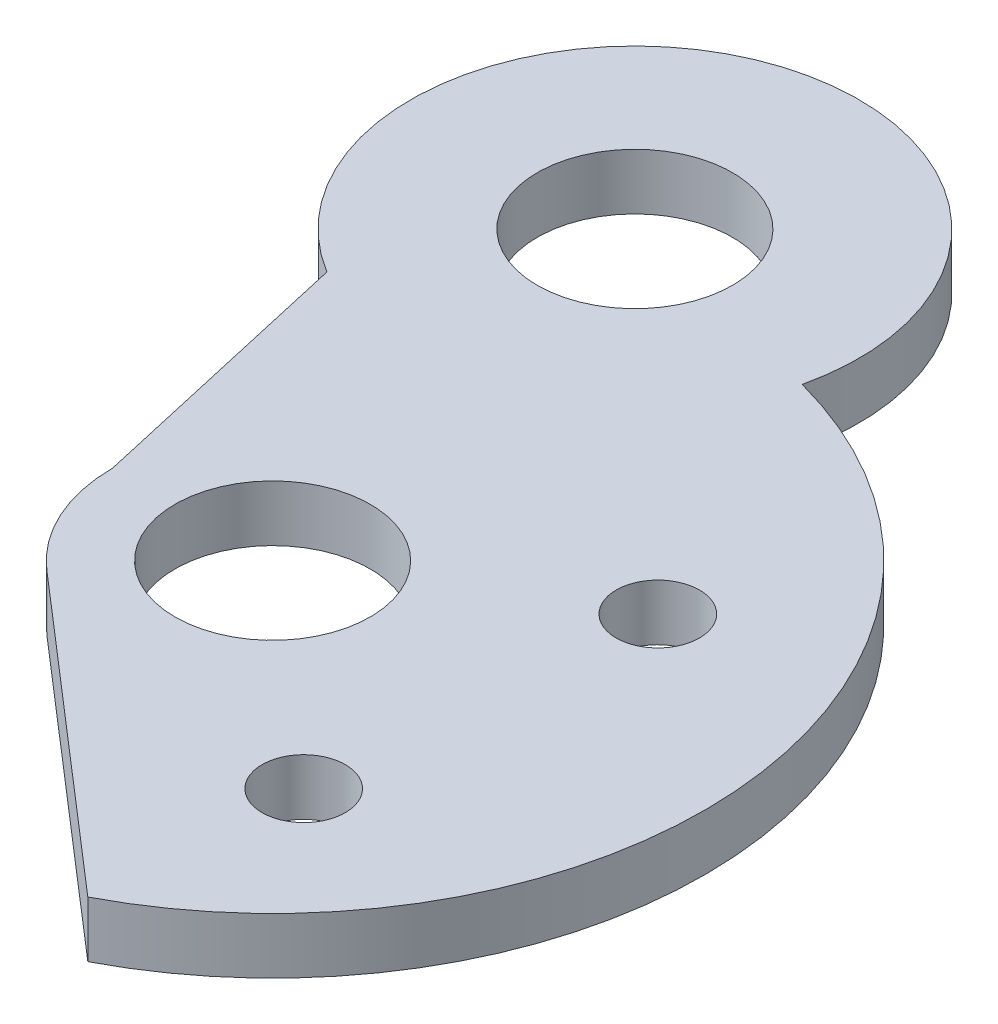
ISO-10303-21;
HEADER;
FILE_DESCRIPTION(('STEP AP214'),'2;1');
FILE_NAME('part.step','',(''),(''),'','','');
FILE_SCHEMA(('AUTOMOTIVE_DESIGN { 1 0 10303 214 1 1 1 1 }'));
ENDSEC;
DATA;
#1=APPLICATION_CONTEXT('core data for automotive mechanical design processes');
#2=APPLICATION_PROTOCOL_DEFINITION('international standard','automotive_design',2000,#1);
#3=PRODUCT_CONTEXT('',#1,'mechanical');
#4=PRODUCT('Part','Part','',(#3));
#5=PRODUCT_RELATED_PRODUCT_CATEGORY('part','',(#4));
#6=PRODUCT_DEFINITION_FORMATION('','',#4);
#7=PRODUCT_DEFINITION_CONTEXT('part definition',#1,'design');
#8=PRODUCT_DEFINITION('design','',#6,#7);
#9=PRODUCT_DEFINITION_SHAPE('','',#8);
#10=(LENGTH_UNIT() NAMED_UNIT(*) SI_UNIT(.MILLI.,.METRE.));
#11=(NAMED_UNIT(*) PLANE_ANGLE_UNIT() SI_UNIT($,.RADIAN.));
#12=(NAMED_UNIT(*) SI_UNIT($,.STERADIAN.) SOLID_ANGLE_UNIT());
#13=UNCERTAINTY_MEASURE_WITH_UNIT(LENGTH_MEASURE(1.E-05),#10,'distance_accuracy_value','');
#14=(GEOMETRIC_REPRESENTATION_CONTEXT(3) GLOBAL_UNCERTAINTY_ASSIGNED_CONTEXT((#13)) GLOBAL_UNIT_ASSIGNED_CONTEXT((#10,
#11,#12)) REPRESENTATION_CONTEXT('',''));
#15=CARTESIAN_POINT('',(0.,0.,0.));
#16=DIRECTION('',(0.,0.,1.));
#17=DIRECTION('',(1.,0.,0.));
#18=AXIS2_PLACEMENT_3D('',#15,#16,#17);
#19=CARTESIAN_POINT('',(0.,0.,0.));
#20=DIRECTION('',(0.,1.,0.));
#21=DIRECTION('',(0.,0.,1.));
#22=AXIS2_PLACEMENT_3D('',#19,#20,#21);
#23=PLANE('',#22);
#24=CARTESIAN_POINT('',(14.9212028761966,0.,-9.14372488252911));
#25=DIRECTION('',(0.,1.,0.));
#26=DIRECTION('',(0.,0.,1.));
#27=AXIS2_PLACEMENT_3D('',#24,#25,#26);
#28=CIRCLE('',#27,2.6);
#29=CARTESIAN_POINT('',(14.9212028761966,0.,-6.5437248825291));
#30=VERTEX_POINT('',#29);
#31=EDGE_CURVE('E161',#30,#30,#28,.T.);
#32=ORIENTED_EDGE('',*,*,#31,.T.);
#33=EDGE_LOOP('',(#32));
#34=FACE_BOUND('',#33,.T.);
#35=CARTESIAN_POINT('',(13.3071043980005,0.,11.3653408457782));
#36=DIRECTION('',(0.,1.,0.));
#37=DIRECTION('',(0.,0.,1.));
#38=AXIS2_PLACEMENT_3D('',#35,#36,#37);
#39=CIRCLE('',#38,2.6);
#40=CARTESIAN_POINT('',(13.3071043980005,0.,13.9653408457782));
#41=VERTEX_POINT('',#40);
#42=EDGE_CURVE('E165',#41,#41,#39,.T.);
#43=ORIENTED_EDGE('',*,*,#42,.T.);
#44=EDGE_LOOP('',(#43));
#45=FACE_BOUND('',#44,.T.);
#46=CARTESIAN_POINT('',(0.,0.,0.));
#47=DIRECTION('',(0.,1.,0.));
#48=DIRECTION('',(0.,0.,1.));
#49=AXIS2_PLACEMENT_3D('',#46,#47,#48);
#50=CIRCLE('',#49,6.1);
#51=CARTESIAN_POINT('',(0.,0.,6.1));
#52=VERTEX_POINT('',#51);
#53=EDGE_CURVE('E113',#52,#52,#50,.T.);
#54=ORIENTED_EDGE('',*,*,#53,.T.);
#55=EDGE_LOOP('',(#54));
#56=FACE_BOUND('',#55,.T.);
#57=CARTESIAN_POINT('',(-6.626815852147,0.,-29.2589355866158));
#58=DIRECTION('',(0.,1.,0.));
#59=DIRECTION('',(0.,0.,1.));
#60=AXIS2_PLACEMENT_3D('',#57,#58,#59);
#61=CIRCLE('',#60,6.1);
#62=CARTESIAN_POINT('',(-6.626815852147,0.,-23.1589355866158));
#63=VERTEX_POINT('',#62);
#64=EDGE_CURVE('E126',#63,#63,#61,.T.);
#65=ORIENTED_EDGE('',*,*,#64,.T.);
#66=EDGE_LOOP('',(#65));
#67=FACE_BOUND('',#66,.T.);
#68=CARTESIAN_POINT('',(-6.626815852147,0.,-29.2589355866158));
#69=DIRECTION('',(0.,1.,0.));
#70=DIRECTION('',(0.,0.,1.));
#71=AXIS2_PLACEMENT_3D('',#68,#69,#70);
#72=CIRCLE('',#71,14.);
#73=CARTESIAN_POINT('',(7.00635022870263,0.,-26.0751041507557));
#74=VERTEX_POINT('',#73);
#75=CARTESIAN_POINT('',(-13.9202447021935,0.,-17.3087935117571));
#76=VERTEX_POINT('',#75);
#77=EDGE_CURVE('E97',#74,#76,#72,.T.);
#78=ORIENTED_EDGE('',*,*,#77,.F.);
#79=CARTESIAN_POINT('',(0.,0.,0.));
#80=DIRECTION('',(0.,1.,0.));
#81=DIRECTION('',(0.,0.,1.));
#82=AXIS2_PLACEMENT_3D('',#79,#80,#81);
#83=CIRCLE('',#82,27.);
#84=CARTESIAN_POINT('',(12.4259132211095,0.,23.9707463509474));
#85=VERTEX_POINT('',#84);
#86=EDGE_CURVE('E11',#85,#74,#83,.T.);
#87=ORIENTED_EDGE('',*,*,#86,.F.);
#88=DIRECTION('',(0.75630697070973,0.,0.654216910554803));
#89=VECTOR('',#88,1.);
#90=CARTESIAN_POINT('',(-6.54216910554804,0.,7.5630697070973));
#91=LINE('',#90,#89);
#92=CARTESIAN_POINT('',(-6.54216910554803,0.,7.5630697070973));
#93=VERTEX_POINT('',#92);
#94=EDGE_CURVE('E95',#93,#85,#91,.T.);
#95=ORIENTED_EDGE('',*,*,#94,.F.);
#96=CARTESIAN_POINT('',(0.,0.,0.));
#97=DIRECTION('',(0.,1.,0.));
#98=DIRECTION('',(0.,0.,1.));
#99=AXIS2_PLACEMENT_3D('',#96,#97,#98);
#100=CIRCLE('',#99,10.);
#101=CARTESIAN_POINT('',(-10.,0.,0.));
#102=VERTEX_POINT('',#101);
#103=EDGE_CURVE('E109',#102,#93,#100,.T.);
#104=ORIENTED_EDGE('',*,*,#103,.F.);
#105=DIRECTION('',(-0.220893861738233,0.,-0.975297852887194));
#106=VECTOR('',#105,1.);
#107=CARTESIAN_POINT('',(-9.51205901846372,0.,2.1543730906926));
#108=LINE('',#107,#106);
#109=EDGE_CURVE('E123',#102,#76,#108,.T.);
#110=ORIENTED_EDGE('',*,*,#109,.T.);
#111=EDGE_LOOP('',(#78,#87,#95,#104,#110));
#112=FACE_BOUND('',#111,.T.);
#113=ADVANCED_FACE('F46',(#34,#45,#56,#67,#112),#23,.F.);
#114=CARTESIAN_POINT('',(0.,3.5,0.));
#115=DIRECTION('',(0.,1.,0.));
#116=DIRECTION('',(0.,0.,1.));
#117=AXIS2_PLACEMENT_3D('',#114,#115,#116);
#118=PLANE('',#117);
#119=CARTESIAN_POINT('',(14.9212028761966,3.5,-9.14372488252911));
#120=DIRECTION('',(0.,1.,0.));
#121=DIRECTION('',(0.,0.,1.));
#122=AXIS2_PLACEMENT_3D('',#119,#120,#121);
#123=CIRCLE('',#122,2.6);
#124=CARTESIAN_POINT('',(14.9212028761966,3.5,-6.5437248825291));
#125=VERTEX_POINT('',#124);
#126=EDGE_CURVE('E169',#125,#125,#123,.T.);
#127=ORIENTED_EDGE('',*,*,#126,.F.);
#128=EDGE_LOOP('',(#127));
#129=FACE_BOUND('',#128,.T.);
#130=CARTESIAN_POINT('',(13.3071043980005,3.5,11.3653408457782));
#131=DIRECTION('',(0.,1.,0.));
#132=DIRECTION('',(0.,0.,1.));
#133=AXIS2_PLACEMENT_3D('',#130,#131,#132);
#134=CIRCLE('',#133,2.6);
#135=CARTESIAN_POINT('',(13.3071043980005,3.5,13.9653408457782));
#136=VERTEX_POINT('',#135);
#137=EDGE_CURVE('E103',#136,#136,#134,.T.);
#138=ORIENTED_EDGE('',*,*,#137,.F.);
#139=EDGE_LOOP('',(#138));
#140=FACE_BOUND('',#139,.T.);
#141=CARTESIAN_POINT('',(-6.626815852147,3.5,-29.2589355866158));
#142=DIRECTION('',(0.,1.,0.));
#143=DIRECTION('',(0.,0.,1.));
#144=AXIS2_PLACEMENT_3D('',#141,#142,#143);
#145=CIRCLE('',#144,6.1);
#146=CARTESIAN_POINT('',(-6.626815852147,3.5,-23.1589355866158));
#147=VERTEX_POINT('',#146);
#148=EDGE_CURVE('E143',#147,#147,#145,.F.);
#149=ORIENTED_EDGE('',*,*,#148,.T.);
#150=EDGE_LOOP('',(#149));
#151=FACE_BOUND('',#150,.T.);
#152=CARTESIAN_POINT('',(0.,3.5,0.));
#153=DIRECTION('',(0.,1.,0.));
#154=DIRECTION('',(0.,0.,1.));
#155=AXIS2_PLACEMENT_3D('',#152,#153,#154);
#156=CIRCLE('',#155,6.1);
#157=CARTESIAN_POINT('',(0.,3.5,6.1));
#158=VERTEX_POINT('',#157);
#159=EDGE_CURVE('E139',#158,#158,#156,.F.);
#160=ORIENTED_EDGE('',*,*,#159,.T.);
#161=EDGE_LOOP('',(#160));
#162=FACE_BOUND('',#161,.T.);
#163=DIRECTION('',(0.75630697070973,0.,0.654216910554803));
#164=VECTOR('',#163,1.);
#165=CARTESIAN_POINT('',(-6.54216910554804,3.5,7.5630697070973));
#166=LINE('',#165,#164);
#167=CARTESIAN_POINT('',(-6.54216910554804,3.5,7.5630697070973));
#168=VERTEX_POINT('',#167);
#169=CARTESIAN_POINT('',(12.4259132211095,3.5,23.9707463509474));
#170=VERTEX_POINT('',#169);
#171=EDGE_CURVE('E147',#168,#170,#166,.T.);
#172=ORIENTED_EDGE('',*,*,#171,.T.);
#173=CARTESIAN_POINT('',(0.,3.5,0.));
#174=DIRECTION('',(0.,1.,0.));
#175=DIRECTION('',(0.,0.,1.));
#176=AXIS2_PLACEMENT_3D('',#173,#174,#175);
#177=CIRCLE('',#176,27.);
#178=CARTESIAN_POINT('',(7.00635022870263,3.5,-26.0751041507557));
#179=VERTEX_POINT('',#178);
#180=EDGE_CURVE('E62',#170,#179,#177,.T.);
#181=ORIENTED_EDGE('',*,*,#180,.T.);
#182=CARTESIAN_POINT('',(-6.626815852147,3.5,-29.2589355866158));
#183=DIRECTION('',(0.,1.,0.));
#184=DIRECTION('',(0.,0.,1.));
#185=AXIS2_PLACEMENT_3D('',#182,#183,#184);
#186=CIRCLE('',#185,14.);
#187=CARTESIAN_POINT('',(-13.9202447021935,3.5,-17.3087935117571));
#188=VERTEX_POINT('',#187);
#189=EDGE_CURVE('E156',#179,#188,#186,.T.);
#190=ORIENTED_EDGE('',*,*,#189,.T.);
#191=DIRECTION('',(0.220893861738233,0.,0.975297852887194));
#192=VECTOR('',#191,1.);
#193=CARTESIAN_POINT('',(-13.9202447021935,3.5,-17.3087935117571));
#194=LINE('',#193,#192);
#195=CARTESIAN_POINT('',(-10.,3.5,0.));
#196=VERTEX_POINT('',#195);
#197=EDGE_CURVE('E153',#188,#196,#194,.T.);
#198=ORIENTED_EDGE('',*,*,#197,.T.);
#199=CARTESIAN_POINT('',(0.,3.5,0.));
#200=DIRECTION('',(0.,1.,0.));
#201=DIRECTION('',(0.,0.,1.));
#202=AXIS2_PLACEMENT_3D('',#199,#200,#201);
#203=CIRCLE('',#202,10.);
#204=EDGE_CURVE('E150',#196,#168,#203,.T.);
#205=ORIENTED_EDGE('',*,*,#204,.T.);
#206=EDGE_LOOP('',(#172,#181,#190,#198,#205));
#207=FACE_BOUND('',#206,.T.);
#208=ADVANCED_FACE('F180',(#129,#140,#151,#162,#207),#118,.T.);
#209=CARTESIAN_POINT('',(-6.54216910554804,0.,7.5630697070973));
#210=DIRECTION('',(-0.654216910554803,0.,0.75630697070973));
#211=DIRECTION('',(0.75630697070973,0.,0.654216910554803));
#212=AXIS2_PLACEMENT_3D('',#209,#210,#211);
#213=PLANE('',#212);
#214=ORIENTED_EDGE('',*,*,#94,.T.);
#215=DIRECTION('',(0.,1.,0.));
#216=VECTOR('',#215,1.);
#217=CARTESIAN_POINT('',(12.4259132211095,0.,23.9707463509474));
#218=LINE('',#217,#216);
#219=EDGE_CURVE('E99',#85,#170,#218,.T.);
#220=ORIENTED_EDGE('',*,*,#219,.T.);
#221=ORIENTED_EDGE('',*,*,#171,.F.);
#222=DIRECTION('',(0.,1.,0.));
#223=VECTOR('',#222,1.);
#224=CARTESIAN_POINT('',(-6.54216910554803,0.,7.5630697070973));
#225=LINE('',#224,#223);
#226=EDGE_CURVE('E55',#93,#168,#225,.T.);
#227=ORIENTED_EDGE('',*,*,#226,.F.);
#228=EDGE_LOOP('',(#214,#220,#221,#227));
#229=FACE_BOUND('',#228,.T.);
#230=ADVANCED_FACE('F106',(#229),#213,.T.);
#231=CARTESIAN_POINT('',(0.,0.,0.));
#232=DIRECTION('',(0.,1.,0.));
#233=DIRECTION('',(0.,0.,1.));
#234=AXIS2_PLACEMENT_3D('',#231,#232,#233);
#235=CYLINDRICAL_SURFACE('',#234,10.);
#236=ORIENTED_EDGE('',*,*,#226,.T.);
#237=ORIENTED_EDGE('',*,*,#204,.F.);
#238=DIRECTION('',(0.,1.,0.));
#239=VECTOR('',#238,1.);
#240=CARTESIAN_POINT('',(-10.,0.,0.));
#241=LINE('',#240,#239);
#242=EDGE_CURVE('E119',#102,#196,#241,.T.);
#243=ORIENTED_EDGE('',*,*,#242,.F.);
#244=ORIENTED_EDGE('',*,*,#103,.T.);
#245=EDGE_LOOP('',(#236,#237,#243,#244));
#246=FACE_BOUND('',#245,.T.);
#247=ADVANCED_FACE('F191',(#246),#235,.T.);
#248=CARTESIAN_POINT('',(0.,10.,0.));
#249=DIRECTION('',(0.,-1.,0.));
#250=DIRECTION('',(0.,0.,-1.));
#251=AXIS2_PLACEMENT_3D('',#248,#249,#250);
#252=CYLINDRICAL_SURFACE('',#251,27.);
#253=ORIENTED_EDGE('',*,*,#180,.F.);
#254=ORIENTED_EDGE('',*,*,#219,.F.);
#255=ORIENTED_EDGE('',*,*,#86,.T.);
#256=DIRECTION('',(0.,1.,0.));
#257=VECTOR('',#256,1.);
#258=CARTESIAN_POINT('',(7.00635022870263,0.,-26.0751041507557));
#259=LINE('',#258,#257);
#260=EDGE_CURVE('E131',#74,#179,#259,.T.);
#261=ORIENTED_EDGE('',*,*,#260,.T.);
#262=EDGE_LOOP('',(#253,#254,#255,#261));
#263=FACE_BOUND('',#262,.T.);
#264=ADVANCED_FACE('F48',(#263),#252,.T.);
#265=CARTESIAN_POINT('',(0.,0.,0.));
#266=DIRECTION('',(0.,1.,0.));
#267=DIRECTION('',(0.,0.,1.));
#268=AXIS2_PLACEMENT_3D('',#265,#266,#267);
#269=CYLINDRICAL_SURFACE('',#268,6.1);
#270=ORIENTED_EDGE('',*,*,#53,.F.);
#271=EDGE_LOOP('',(#270));
#272=FACE_BOUND('',#271,.T.);
#273=ORIENTED_EDGE('',*,*,#159,.F.);
#274=EDGE_LOOP('',(#273));
#275=FACE_BOUND('',#274,.T.);
#276=ADVANCED_FACE('F222',(#272,#275),#269,.F.);
#277=CARTESIAN_POINT('',(-9.51205901846372,0.,2.1543730906926));
#278=DIRECTION('',(0.975297852887194,0.,-0.220893861738233));
#279=DIRECTION('',(-0.220893861738233,0.,-0.975297852887194));
#280=AXIS2_PLACEMENT_3D('',#277,#278,#279);
#281=PLANE('',#280);
#282=ORIENTED_EDGE('',*,*,#197,.F.);
#283=DIRECTION('',(0.,1.,0.));
#284=VECTOR('',#283,1.);
#285=CARTESIAN_POINT('',(-13.9202447021935,0.,-17.3087935117571));
#286=LINE('',#285,#284);
#287=EDGE_CURVE('E130',#76,#188,#286,.T.);
#288=ORIENTED_EDGE('',*,*,#287,.F.);
#289=ORIENTED_EDGE('',*,*,#109,.F.);
#290=ORIENTED_EDGE('',*,*,#242,.T.);
#291=EDGE_LOOP('',(#282,#288,#289,#290));
#292=FACE_BOUND('',#291,.T.);
#293=ADVANCED_FACE('F196',(#292),#281,.F.);
#294=CARTESIAN_POINT('',(-6.626815852147,0.,-29.2589355866158));
#295=DIRECTION('',(0.,1.,0.));
#296=DIRECTION('',(0.,0.,1.));
#297=AXIS2_PLACEMENT_3D('',#294,#295,#296);
#298=CYLINDRICAL_SURFACE('',#297,6.1);
#299=ORIENTED_EDGE('',*,*,#64,.F.);
#300=EDGE_LOOP('',(#299));
#301=FACE_BOUND('',#300,.T.);
#302=ORIENTED_EDGE('',*,*,#148,.F.);
#303=EDGE_LOOP('',(#302));
#304=FACE_BOUND('',#303,.T.);
#305=ADVANCED_FACE('F201',(#301,#304),#298,.F.);
#306=CARTESIAN_POINT('',(-6.626815852147,0.,-29.2589355866158));
#307=DIRECTION('',(0.,1.,0.));
#308=DIRECTION('',(0.,0.,1.));
#309=AXIS2_PLACEMENT_3D('',#306,#307,#308);
#310=CYLINDRICAL_SURFACE('',#309,14.);
#311=ORIENTED_EDGE('',*,*,#287,.T.);
#312=ORIENTED_EDGE('',*,*,#189,.F.);
#313=ORIENTED_EDGE('',*,*,#260,.F.);
#314=ORIENTED_EDGE('',*,*,#77,.T.);
#315=EDGE_LOOP('',(#311,#312,#313,#314));
#316=FACE_BOUND('',#315,.T.);
#317=ADVANCED_FACE('F198',(#316),#310,.T.);
#318=CARTESIAN_POINT('',(13.3071043980005,-6.5,11.3653408457782));
#319=DIRECTION('',(0.,1.,0.));
#320=DIRECTION('',(0.,0.,1.));
#321=AXIS2_PLACEMENT_3D('',#318,#319,#320);
#322=CYLINDRICAL_SURFACE('',#321,2.6);
#323=ORIENTED_EDGE('',*,*,#137,.T.);
#324=EDGE_LOOP('',(#323));
#325=FACE_BOUND('',#324,.T.);
#326=ORIENTED_EDGE('',*,*,#42,.F.);
#327=EDGE_LOOP('',(#326));
#328=FACE_BOUND('',#327,.T.);
#329=ADVANCED_FACE('F200',(#325,#328),#322,.F.);
#330=CARTESIAN_POINT('',(14.9212028761966,-6.5,-9.14372488252911));
#331=DIRECTION('',(0.,1.,0.));
#332=DIRECTION('',(0.,0.,1.));
#333=AXIS2_PLACEMENT_3D('',#330,#331,#332);
#334=CYLINDRICAL_SURFACE('',#333,2.6);
#335=ORIENTED_EDGE('',*,*,#126,.T.);
#336=EDGE_LOOP('',(#335));
#337=FACE_BOUND('',#336,.T.);
#338=ORIENTED_EDGE('',*,*,#31,.F.);
#339=EDGE_LOOP('',(#338));
#340=FACE_BOUND('',#339,.T.);
#341=ADVANCED_FACE('F177',(#337,#340),#334,.F.);
#342=CLOSED_SHELL('',(#113,#208,#230,#247,#264,#276,#293,#305,#317,#329,#341));
#343=MANIFOLD_SOLID_BREP('B2',#342);
#344=ADVANCED_BREP_SHAPE_REPRESENTATION('',(#18,#343),#14);
#345=SHAPE_DEFINITION_REPRESENTATION(#9,#344);
ENDSEC;
END-ISO-10303-21;
